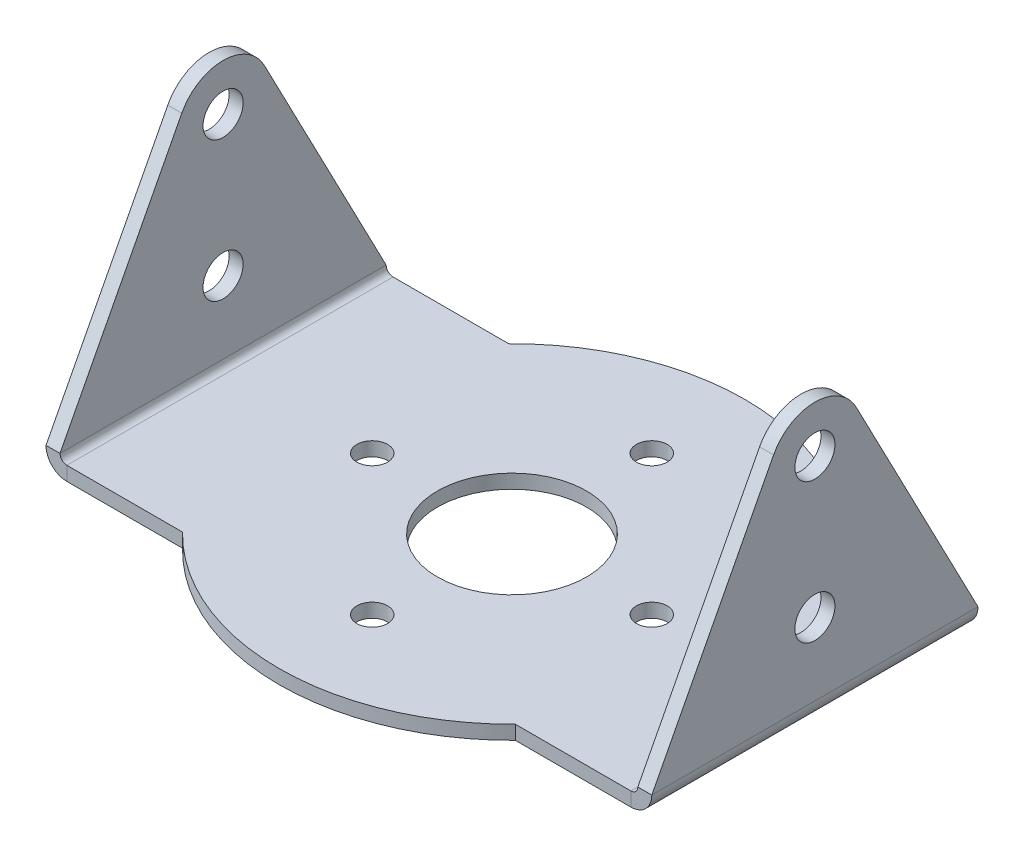
ISO-10303-21;
HEADER;
FILE_DESCRIPTION(('STEP AP214'),'2;1');
FILE_NAME('part.step','',(''),(''),'','','');
FILE_SCHEMA(('AUTOMOTIVE_DESIGN { 1 0 10303 214 1 1 1 1 }'));
ENDSEC;
DATA;
#1=APPLICATION_CONTEXT('core data for automotive mechanical design processes');
#2=APPLICATION_PROTOCOL_DEFINITION('international standard','automotive_design',2000,#1);
#3=PRODUCT_CONTEXT('',#1,'mechanical');
#4=PRODUCT('Part','Part','',(#3));
#5=PRODUCT_RELATED_PRODUCT_CATEGORY('part','',(#4));
#6=PRODUCT_DEFINITION_FORMATION('','',#4);
#7=PRODUCT_DEFINITION_CONTEXT('part definition',#1,'design');
#8=PRODUCT_DEFINITION('design','',#6,#7);
#9=PRODUCT_DEFINITION_SHAPE('','',#8);
#10=(LENGTH_UNIT() NAMED_UNIT(*) SI_UNIT(.MILLI.,.METRE.));
#11=(NAMED_UNIT(*) PLANE_ANGLE_UNIT() SI_UNIT($,.RADIAN.));
#12=(NAMED_UNIT(*) SI_UNIT($,.STERADIAN.) SOLID_ANGLE_UNIT());
#13=UNCERTAINTY_MEASURE_WITH_UNIT(LENGTH_MEASURE(1.E-05),#10,'distance_accuracy_value','');
#14=(GEOMETRIC_REPRESENTATION_CONTEXT(3) GLOBAL_UNCERTAINTY_ASSIGNED_CONTEXT((#13)) GLOBAL_UNIT_ASSIGNED_CONTEXT((#10,
#11,#12)) REPRESENTATION_CONTEXT('',''));
#15=CARTESIAN_POINT('',(0.,0.,0.));
#16=DIRECTION('',(0.,0.,1.));
#17=DIRECTION('',(1.,0.,0.));
#18=AXIS2_PLACEMENT_3D('',#15,#16,#17);
#19=CARTESIAN_POINT('',(-32.5,-1.1601605450924E-13,0.));
#20=DIRECTION('',(1.,0.,0.));
#21=DIRECTION('',(0.,1.,0.));
#22=AXIS2_PLACEMENT_3D('',#19,#20,#21);
#23=PLANE('',#22);
#24=CARTESIAN_POINT('',(-32.5000000000002,10.0000000000002,0.));
#25=DIRECTION('',(1.,0.,0.));
#26=DIRECTION('',(0.,1.,0.));
#27=AXIS2_PLACEMENT_3D('',#24,#25,#26);
#28=CIRCLE('',#27,2.15);
#29=CARTESIAN_POINT('',(-32.5000000000002,12.1500000000002,0.));
#30=VERTEX_POINT('',#29);
#31=EDGE_CURVE('E472',#30,#30,#28,.T.);
#32=ORIENTED_EDGE('',*,*,#31,.T.);
#33=EDGE_LOOP('',(#32));
#34=FACE_BOUND('',#33,.T.);
#35=CARTESIAN_POINT('',(-32.5000000000001,25.0000000000002,0.));
#36=DIRECTION('',(1.,0.,0.));
#37=DIRECTION('',(0.,1.,0.));
#38=AXIS2_PLACEMENT_3D('',#35,#36,#37);
#39=CIRCLE('',#38,2.15);
#40=CARTESIAN_POINT('',(-32.5000000000001,27.1500000000002,0.));
#41=VERTEX_POINT('',#40);
#42=EDGE_CURVE('E465',#41,#41,#39,.T.);
#43=ORIENTED_EDGE('',*,*,#42,.T.);
#44=EDGE_LOOP('',(#43));
#45=FACE_BOUND('',#44,.T.);
#46=DIRECTION('',(0.,0.886819328991356,0.462116303247701));
#47=VECTOR('',#46,1.);
#48=CARTESIAN_POINT('',(-32.5000000000002,7.64936845942169,-14.6794383940091));
#49=LINE('',#48,#47);
#50=CARTESIAN_POINT('',(-32.5000000000002,2.23660000000023,-17.5));
#51=VERTEX_POINT('',#50);
#52=CARTESIAN_POINT('',(-32.5000000000001,27.3105815162387,-4.43409664495678));
#53=VERTEX_POINT('',#52);
#54=EDGE_CURVE('E258',#51,#53,#49,.T.);
#55=ORIENTED_EDGE('',*,*,#54,.F.);
#56=DIRECTION('',(0.,0.,1.));
#57=VECTOR('',#56,1.);
#58=CARTESIAN_POINT('',(-32.5,2.23659999999999,-17.5));
#59=LINE('',#58,#57);
#60=CARTESIAN_POINT('',(-32.5000000000002,2.23660000000023,17.5));
#61=VERTEX_POINT('',#60);
#62=EDGE_CURVE('E339',#61,#51,#59,.F.);
#63=ORIENTED_EDGE('',*,*,#62,.F.);
#64=DIRECTION('',(0.,0.886819328991356,-0.462116303247701));
#65=VECTOR('',#64,1.);
#66=CARTESIAN_POINT('',(-32.5000000000002,7.64936845942169,14.6794383940091));
#67=LINE('',#66,#65);
#68=CARTESIAN_POINT('',(-32.5000000000001,27.3105815162387,4.43409664495678));
#69=VERTEX_POINT('',#68);
#70=EDGE_CURVE('E260',#61,#69,#67,.T.);
#71=ORIENTED_EDGE('',*,*,#70,.T.);
#72=CARTESIAN_POINT('',(-32.5000000000001,25.0000000000002,0.));
#73=DIRECTION('',(1.,0.,0.));
#74=DIRECTION('',(0.,1.,0.));
#75=AXIS2_PLACEMENT_3D('',#72,#73,#74);
#76=CIRCLE('',#75,5.);
#77=EDGE_CURVE('E255',#69,#53,#76,.F.);
#78=ORIENTED_EDGE('',*,*,#77,.T.);
#79=EDGE_LOOP('',(#55,#63,#71,#78));
#80=FACE_BOUND('',#79,.T.);
#81=ADVANCED_FACE('F139',(#34,#45,#80),#23,.F.);
#82=CARTESIAN_POINT('',(-31.,-1.10778832500975E-13,0.));
#83=DIRECTION('',(1.,0.,0.));
#84=DIRECTION('',(0.,1.,0.));
#85=AXIS2_PLACEMENT_3D('',#82,#83,#84);
#86=PLANE('',#85);
#87=CARTESIAN_POINT('',(-31.,10.0000000000002,0.));
#88=DIRECTION('',(1.,0.,0.));
#89=DIRECTION('',(0.,1.,0.));
#90=AXIS2_PLACEMENT_3D('',#87,#88,#89);
#91=CIRCLE('',#90,2.15);
#92=CARTESIAN_POINT('',(-31.,12.1500000000002,0.));
#93=VERTEX_POINT('',#92);
#94=EDGE_CURVE('E292',#93,#93,#91,.T.);
#95=ORIENTED_EDGE('',*,*,#94,.F.);
#96=EDGE_LOOP('',(#95));
#97=FACE_BOUND('',#96,.T.);
#98=CARTESIAN_POINT('',(-31.0000000000001,25.0000000000002,0.));
#99=DIRECTION('',(1.,0.,0.));
#100=DIRECTION('',(0.,1.,0.));
#101=AXIS2_PLACEMENT_3D('',#98,#99,#100);
#102=CIRCLE('',#101,2.15);
#103=CARTESIAN_POINT('',(-31.0000000000001,27.1500000000002,0.));
#104=VERTEX_POINT('',#103);
#105=EDGE_CURVE('E289',#104,#104,#102,.T.);
#106=ORIENTED_EDGE('',*,*,#105,.F.);
#107=EDGE_LOOP('',(#106));
#108=FACE_BOUND('',#107,.T.);
#109=DIRECTION('',(0.,0.,1.));
#110=VECTOR('',#109,1.);
#111=CARTESIAN_POINT('',(-31.,2.2366,-17.5));
#112=LINE('',#111,#110);
#113=CARTESIAN_POINT('',(-31.,2.23660000000022,-17.5));
#114=VERTEX_POINT('',#113);
#115=CARTESIAN_POINT('',(-31.,2.23660000000022,17.5));
#116=VERTEX_POINT('',#115);
#117=EDGE_CURVE('E345',#114,#116,#112,.T.);
#118=ORIENTED_EDGE('',*,*,#117,.F.);
#119=DIRECTION('',(0.,0.886819328991356,0.462116303247701));
#120=VECTOR('',#119,1.);
#121=CARTESIAN_POINT('',(-31.,7.64936845942151,-14.6794383940092));
#122=LINE('',#121,#120);
#123=CARTESIAN_POINT('',(-31.0000000000001,27.3105815162387,-4.43409664495678));
#124=VERTEX_POINT('',#123);
#125=EDGE_CURVE('E282',#114,#124,#122,.T.);
#126=ORIENTED_EDGE('',*,*,#125,.T.);
#127=CARTESIAN_POINT('',(-31.0000000000001,25.0000000000002,0.));
#128=DIRECTION('',(1.,0.,0.));
#129=DIRECTION('',(0.,1.,0.));
#130=AXIS2_PLACEMENT_3D('',#127,#128,#129);
#131=CIRCLE('',#130,5.);
#132=CARTESIAN_POINT('',(-31.0000000000001,27.3105815162387,4.43409664495678));
#133=VERTEX_POINT('',#132);
#134=EDGE_CURVE('E278',#133,#124,#131,.F.);
#135=ORIENTED_EDGE('',*,*,#134,.F.);
#136=DIRECTION('',(0.,0.886819328991356,-0.462116303247701));
#137=VECTOR('',#136,1.);
#138=CARTESIAN_POINT('',(-31.,7.64936845942151,14.6794383940092));
#139=LINE('',#138,#137);
#140=EDGE_CURVE('E306',#116,#133,#139,.T.);
#141=ORIENTED_EDGE('',*,*,#140,.F.);
#142=EDGE_LOOP('',(#118,#126,#135,#141));
#143=FACE_BOUND('',#142,.T.);
#144=ADVANCED_FACE('F496',(#97,#108,#143),#86,.T.);
#145=CARTESIAN_POINT('',(32.5,-1.1601605450924E-13,0.));
#146=DIRECTION('',(-1.,0.,0.));
#147=DIRECTION('',(0.,-1.,0.));
#148=AXIS2_PLACEMENT_3D('',#145,#146,#147);
#149=PLANE('',#148);
#150=CARTESIAN_POINT('',(32.5,10.,0.));
#151=DIRECTION('',(1.,0.,0.));
#152=DIRECTION('',(0.,1.,0.));
#153=AXIS2_PLACEMENT_3D('',#150,#151,#152);
#154=CIRCLE('',#153,2.15);
#155=CARTESIAN_POINT('',(32.5,12.15,0.));
#156=VERTEX_POINT('',#155);
#157=EDGE_CURVE('E475',#156,#156,#154,.T.);
#158=ORIENTED_EDGE('',*,*,#157,.F.);
#159=EDGE_LOOP('',(#158));
#160=FACE_BOUND('',#159,.T.);
#161=CARTESIAN_POINT('',(32.5000000000001,25.,0.));
#162=DIRECTION('',(1.,0.,0.));
#163=DIRECTION('',(0.,1.,0.));
#164=AXIS2_PLACEMENT_3D('',#161,#162,#163);
#165=CIRCLE('',#164,2.15);
#166=CARTESIAN_POINT('',(32.5000000000001,27.15,0.));
#167=VERTEX_POINT('',#166);
#168=EDGE_CURVE('E467',#167,#167,#165,.T.);
#169=ORIENTED_EDGE('',*,*,#168,.F.);
#170=EDGE_LOOP('',(#169));
#171=FACE_BOUND('',#170,.T.);
#172=DIRECTION('',(0.,0.886819328991356,0.462116303247701));
#173=VECTOR('',#172,1.);
#174=CARTESIAN_POINT('',(32.5,7.64936845942145,-14.6794383940091));
#175=LINE('',#174,#173);
#176=CARTESIAN_POINT('',(32.5,2.23659999999999,-17.5));
#177=VERTEX_POINT('',#176);
#178=CARTESIAN_POINT('',(32.5000000000001,27.3105815162385,-4.43409664495678));
#179=VERTEX_POINT('',#178);
#180=EDGE_CURVE('E274',#177,#179,#175,.T.);
#181=ORIENTED_EDGE('',*,*,#180,.T.);
#182=CARTESIAN_POINT('',(32.5000000000001,25.,0.));
#183=DIRECTION('',(1.,0.,0.));
#184=DIRECTION('',(0.,1.,0.));
#185=AXIS2_PLACEMENT_3D('',#182,#183,#184);
#186=CIRCLE('',#185,5.);
#187=CARTESIAN_POINT('',(32.5000000000001,27.3105815162385,4.43409664495678));
#188=VERTEX_POINT('',#187);
#189=EDGE_CURVE('E296',#188,#179,#186,.F.);
#190=ORIENTED_EDGE('',*,*,#189,.F.);
#191=DIRECTION('',(0.,0.886819328991356,-0.462116303247701));
#192=VECTOR('',#191,1.);
#193=CARTESIAN_POINT('',(32.5,7.64936845942145,14.6794383940091));
#194=LINE('',#193,#192);
#195=CARTESIAN_POINT('',(32.5,2.23659999999999,17.5));
#196=VERTEX_POINT('',#195);
#197=EDGE_CURVE('E295',#196,#188,#194,.T.);
#198=ORIENTED_EDGE('',*,*,#197,.F.);
#199=DIRECTION('',(0.,0.,-1.));
#200=VECTOR('',#199,1.);
#201=CARTESIAN_POINT('',(32.5,2.23659999999999,17.5));
#202=LINE('',#201,#200);
#203=EDGE_CURVE('E309',#177,#196,#202,.F.);
#204=ORIENTED_EDGE('',*,*,#203,.F.);
#205=EDGE_LOOP('',(#181,#190,#198,#204));
#206=FACE_BOUND('',#205,.T.);
#207=ADVANCED_FACE('F447',(#160,#171,#206),#149,.F.);
#208=CARTESIAN_POINT('',(31.,-1.10778832500975E-13,0.));
#209=DIRECTION('',(-1.,0.,0.));
#210=DIRECTION('',(0.,-1.,0.));
#211=AXIS2_PLACEMENT_3D('',#208,#209,#210);
#212=PLANE('',#211);
#213=CARTESIAN_POINT('',(31.,10.,0.));
#214=DIRECTION('',(-1.,0.,0.));
#215=DIRECTION('',(0.,-1.,0.));
#216=AXIS2_PLACEMENT_3D('',#213,#214,#215);
#217=CIRCLE('',#216,2.15);
#218=CARTESIAN_POINT('',(31.,7.85,0.));
#219=VERTEX_POINT('',#218);
#220=EDGE_CURVE('E143',#219,#219,#217,.T.);
#221=ORIENTED_EDGE('',*,*,#220,.F.);
#222=EDGE_LOOP('',(#221));
#223=FACE_BOUND('',#222,.T.);
#224=CARTESIAN_POINT('',(31.0000000000001,25.,0.));
#225=DIRECTION('',(-1.,0.,0.));
#226=DIRECTION('',(0.,-1.,0.));
#227=AXIS2_PLACEMENT_3D('',#224,#225,#226);
#228=CIRCLE('',#227,2.15);
#229=CARTESIAN_POINT('',(31.0000000000001,22.85,0.));
#230=VERTEX_POINT('',#229);
#231=EDGE_CURVE('E288',#230,#230,#228,.T.);
#232=ORIENTED_EDGE('',*,*,#231,.F.);
#233=EDGE_LOOP('',(#232));
#234=FACE_BOUND('',#233,.T.);
#235=CARTESIAN_POINT('',(31.0000000000001,25.,0.));
#236=DIRECTION('',(-1.,0.,0.));
#237=DIRECTION('',(0.,-1.,0.));
#238=AXIS2_PLACEMENT_3D('',#235,#236,#237);
#239=CIRCLE('',#238,5.);
#240=CARTESIAN_POINT('',(31.0000000000001,27.3105815162385,-4.43409664495678));
#241=VERTEX_POINT('',#240);
#242=CARTESIAN_POINT('',(31.0000000000001,27.3105815162385,4.43409664495678));
#243=VERTEX_POINT('',#242);
#244=EDGE_CURVE('E303',#241,#243,#239,.F.);
#245=ORIENTED_EDGE('',*,*,#244,.F.);
#246=DIRECTION('',(0.,-0.886819328991356,-0.462116303247701));
#247=VECTOR('',#246,1.);
#248=CARTESIAN_POINT('',(31.,7.64936845942146,-14.6794383940091));
#249=LINE('',#248,#247);
#250=CARTESIAN_POINT('',(31.,2.2366,-17.5));
#251=VERTEX_POINT('',#250);
#252=EDGE_CURVE('E279',#241,#251,#249,.T.);
#253=ORIENTED_EDGE('',*,*,#252,.T.);
#254=DIRECTION('',(0.,0.,-1.));
#255=VECTOR('',#254,1.);
#256=CARTESIAN_POINT('',(31.,2.2366,17.5));
#257=LINE('',#256,#255);
#258=CARTESIAN_POINT('',(31.0000000000001,2.2366,17.5));
#259=VERTEX_POINT('',#258);
#260=EDGE_CURVE('E316',#259,#251,#257,.T.);
#261=ORIENTED_EDGE('',*,*,#260,.F.);
#262=DIRECTION('',(0.,-0.886819328991356,0.462116303247701));
#263=VECTOR('',#262,1.);
#264=CARTESIAN_POINT('',(31.,7.64936845942146,14.6794383940091));
#265=LINE('',#264,#263);
#266=EDGE_CURVE('E13',#243,#259,#265,.T.);
#267=ORIENTED_EDGE('',*,*,#266,.F.);
#268=EDGE_LOOP('',(#245,#253,#261,#267));
#269=FACE_BOUND('',#268,.T.);
#270=ADVANCED_FACE('F443',(#223,#234,#269),#212,.T.);
#271=CARTESIAN_POINT('',(0.,1.5,0.));
#272=DIRECTION('',(0.,1.,0.));
#273=DIRECTION('',(0.,0.,1.));
#274=AXIS2_PLACEMENT_3D('',#271,#272,#273);
#275=PLANE('',#274);
#276=CARTESIAN_POINT('',(0.,1.5,15.));
#277=DIRECTION('',(0.,1.,0.));
#278=DIRECTION('',(0.,0.,1.));
#279=AXIS2_PLACEMENT_3D('',#276,#277,#278);
#280=CIRCLE('',#279,1.65);
#281=CARTESIAN_POINT('',(0.,1.5,16.65));
#282=VERTEX_POINT('',#281);
#283=EDGE_CURVE('E378',#282,#282,#280,.T.);
#284=ORIENTED_EDGE('',*,*,#283,.F.);
#285=EDGE_LOOP('',(#284));
#286=FACE_BOUND('',#285,.T.);
#287=CARTESIAN_POINT('',(0.,1.5,-15.));
#288=DIRECTION('',(0.,1.,0.));
#289=DIRECTION('',(0.,0.,1.));
#290=AXIS2_PLACEMENT_3D('',#287,#288,#289);
#291=CIRCLE('',#290,1.65);
#292=CARTESIAN_POINT('',(0.,1.5,-13.35));
#293=VERTEX_POINT('',#292);
#294=EDGE_CURVE('E390',#293,#293,#291,.T.);
#295=ORIENTED_EDGE('',*,*,#294,.F.);
#296=EDGE_LOOP('',(#295));
#297=FACE_BOUND('',#296,.T.);
#298=CARTESIAN_POINT('',(0.,1.5,0.));
#299=DIRECTION('',(0.,1.,0.));
#300=DIRECTION('',(0.,0.,1.));
#301=AXIS2_PLACEMENT_3D('',#298,#299,#300);
#302=CIRCLE('',#301,8.);
#303=CARTESIAN_POINT('',(0.,1.5,8.));
#304=VERTEX_POINT('',#303);
#305=EDGE_CURVE('E396',#304,#304,#302,.T.);
#306=ORIENTED_EDGE('',*,*,#305,.F.);
#307=EDGE_LOOP('',(#306));
#308=FACE_BOUND('',#307,.T.);
#309=CARTESIAN_POINT('',(-15.,1.5,0.));
#310=DIRECTION('',(0.,1.,0.));
#311=DIRECTION('',(0.,0.,1.));
#312=AXIS2_PLACEMENT_3D('',#309,#310,#311);
#313=CIRCLE('',#312,1.65);
#314=CARTESIAN_POINT('',(-15.,1.5,1.65000000000003));
#315=VERTEX_POINT('',#314);
#316=EDGE_CURVE('E384',#315,#315,#313,.T.);
#317=ORIENTED_EDGE('',*,*,#316,.F.);
#318=EDGE_LOOP('',(#317));
#319=FACE_BOUND('',#318,.T.);
#320=CARTESIAN_POINT('',(15.,1.5,0.));
#321=DIRECTION('',(0.,1.,0.));
#322=DIRECTION('',(0.,0.,1.));
#323=AXIS2_PLACEMENT_3D('',#320,#321,#322);
#324=CIRCLE('',#323,1.65);
#325=CARTESIAN_POINT('',(15.,1.5,1.64999999999997));
#326=VERTEX_POINT('',#325);
#327=EDGE_CURVE('E372',#326,#326,#324,.T.);
#328=ORIENTED_EDGE('',*,*,#327,.F.);
#329=EDGE_LOOP('',(#328));
#330=FACE_BOUND('',#329,.T.);
#331=DIRECTION('',(1.,0.,0.));
#332=VECTOR('',#331,1.);
#333=CARTESIAN_POINT('',(17.8535710713571,1.5,17.5));
#334=LINE('',#333,#332);
#335=CARTESIAN_POINT('',(17.8535710713571,1.5,17.5));
#336=VERTEX_POINT('',#335);
#337=CARTESIAN_POINT('',(30.2634,1.5,17.5));
#338=VERTEX_POINT('',#337);
#339=EDGE_CURVE('E414',#336,#338,#334,.T.);
#340=ORIENTED_EDGE('',*,*,#339,.T.);
#341=DIRECTION('',(0.,0.,-1.));
#342=VECTOR('',#341,1.);
#343=CARTESIAN_POINT('',(30.2634,1.5,-17.5));
#344=LINE('',#343,#342);
#345=CARTESIAN_POINT('',(30.2634,1.5,-17.5));
#346=VERTEX_POINT('',#345);
#347=EDGE_CURVE('E156',#346,#338,#344,.F.);
#348=ORIENTED_EDGE('',*,*,#347,.F.);
#349=DIRECTION('',(-1.,0.,0.));
#350=VECTOR('',#349,1.);
#351=CARTESIAN_POINT('',(17.8535710713571,1.5,-17.5));
#352=LINE('',#351,#350);
#353=CARTESIAN_POINT('',(17.8535710713571,1.5,-17.5));
#354=VERTEX_POINT('',#353);
#355=EDGE_CURVE('E402',#346,#354,#352,.T.);
#356=ORIENTED_EDGE('',*,*,#355,.T.);
#357=CARTESIAN_POINT('',(0.,1.5,0.));
#358=DIRECTION('',(0.,1.,0.));
#359=DIRECTION('',(0.,0.,1.));
#360=AXIS2_PLACEMENT_3D('',#357,#358,#359);
#361=CIRCLE('',#360,25.);
#362=CARTESIAN_POINT('',(-17.8535710713571,1.5,-17.5));
#363=VERTEX_POINT('',#362);
#364=EDGE_CURVE('E404',#354,#363,#361,.T.);
#365=ORIENTED_EDGE('',*,*,#364,.T.);
#366=DIRECTION('',(-1.,0.,0.));
#367=VECTOR('',#366,1.);
#368=CARTESIAN_POINT('',(-32.5,1.5,-17.5));
#369=LINE('',#368,#367);
#370=CARTESIAN_POINT('',(-30.2634,1.5,-17.5));
#371=VERTEX_POINT('',#370);
#372=EDGE_CURVE('E407',#363,#371,#369,.T.);
#373=ORIENTED_EDGE('',*,*,#372,.T.);
#374=DIRECTION('',(0.,0.,1.));
#375=VECTOR('',#374,1.);
#376=CARTESIAN_POINT('',(-30.2634,1.5,17.5));
#377=LINE('',#376,#375);
#378=CARTESIAN_POINT('',(-30.2634,1.5,17.5));
#379=VERTEX_POINT('',#378);
#380=EDGE_CURVE('E361',#379,#371,#377,.F.);
#381=ORIENTED_EDGE('',*,*,#380,.F.);
#382=DIRECTION('',(1.,0.,0.));
#383=VECTOR('',#382,1.);
#384=CARTESIAN_POINT('',(-32.5,1.5,17.5));
#385=LINE('',#384,#383);
#386=CARTESIAN_POINT('',(-17.8535710713571,1.5,17.5));
#387=VERTEX_POINT('',#386);
#388=EDGE_CURVE('E410',#379,#387,#385,.T.);
#389=ORIENTED_EDGE('',*,*,#388,.T.);
#390=CARTESIAN_POINT('',(0.,1.5,0.));
#391=DIRECTION('',(0.,1.,0.));
#392=DIRECTION('',(0.,0.,1.));
#393=AXIS2_PLACEMENT_3D('',#390,#391,#392);
#394=CIRCLE('',#393,25.);
#395=EDGE_CURVE('E412',#387,#336,#394,.T.);
#396=ORIENTED_EDGE('',*,*,#395,.T.);
#397=EDGE_LOOP('',(#340,#348,#356,#365,#373,#381,#389,#396));
#398=FACE_BOUND('',#397,.T.);
#399=ADVANCED_FACE('F446',(#286,#297,#308,#319,#330,#398),#275,.T.);
#400=CARTESIAN_POINT('',(0.,0.,0.));
#401=DIRECTION('',(0.,1.,0.));
#402=DIRECTION('',(0.,0.,1.));
#403=AXIS2_PLACEMENT_3D('',#400,#401,#402);
#404=PLANE('',#403);
#405=CARTESIAN_POINT('',(0.,0.,0.));
#406=DIRECTION('',(0.,1.,0.));
#407=DIRECTION('',(0.,0.,1.));
#408=AXIS2_PLACEMENT_3D('',#405,#406,#407);
#409=CIRCLE('',#408,8.);
#410=CARTESIAN_POINT('',(0.,0.,8.));
#411=VERTEX_POINT('',#410);
#412=EDGE_CURVE('E393',#411,#411,#409,.T.);
#413=ORIENTED_EDGE('',*,*,#412,.T.);
#414=EDGE_LOOP('',(#413));
#415=FACE_BOUND('',#414,.T.);
#416=CARTESIAN_POINT('',(0.,0.,-15.));
#417=DIRECTION('',(0.,1.,0.));
#418=DIRECTION('',(0.,0.,1.));
#419=AXIS2_PLACEMENT_3D('',#416,#417,#418);
#420=CIRCLE('',#419,1.65);
#421=CARTESIAN_POINT('',(0.,0.,-13.35));
#422=VERTEX_POINT('',#421);
#423=EDGE_CURVE('E387',#422,#422,#420,.T.);
#424=ORIENTED_EDGE('',*,*,#423,.T.);
#425=EDGE_LOOP('',(#424));
#426=FACE_BOUND('',#425,.T.);
#427=CARTESIAN_POINT('',(-15.,0.,0.));
#428=DIRECTION('',(0.,1.,0.));
#429=DIRECTION('',(0.,0.,1.));
#430=AXIS2_PLACEMENT_3D('',#427,#428,#429);
#431=CIRCLE('',#430,1.65);
#432=CARTESIAN_POINT('',(-15.,0.,1.65000000000003));
#433=VERTEX_POINT('',#432);
#434=EDGE_CURVE('E381',#433,#433,#431,.T.);
#435=ORIENTED_EDGE('',*,*,#434,.T.);
#436=EDGE_LOOP('',(#435));
#437=FACE_BOUND('',#436,.T.);
#438=CARTESIAN_POINT('',(0.,0.,15.));
#439=DIRECTION('',(0.,1.,0.));
#440=DIRECTION('',(0.,0.,1.));
#441=AXIS2_PLACEMENT_3D('',#438,#439,#440);
#442=CIRCLE('',#441,1.65);
#443=CARTESIAN_POINT('',(0.,0.,16.65));
#444=VERTEX_POINT('',#443);
#445=EDGE_CURVE('E375',#444,#444,#442,.T.);
#446=ORIENTED_EDGE('',*,*,#445,.T.);
#447=EDGE_LOOP('',(#446));
#448=FACE_BOUND('',#447,.T.);
#449=CARTESIAN_POINT('',(15.,0.,0.));
#450=DIRECTION('',(0.,1.,0.));
#451=DIRECTION('',(0.,0.,1.));
#452=AXIS2_PLACEMENT_3D('',#449,#450,#451);
#453=CIRCLE('',#452,1.65);
#454=CARTESIAN_POINT('',(15.,0.,1.64999999999997));
#455=VERTEX_POINT('',#454);
#456=EDGE_CURVE('E369',#455,#455,#453,.T.);
#457=ORIENTED_EDGE('',*,*,#456,.T.);
#458=EDGE_LOOP('',(#457));
#459=FACE_BOUND('',#458,.T.);
#460=DIRECTION('',(0.,0.,-1.));
#461=VECTOR('',#460,1.);
#462=CARTESIAN_POINT('',(30.2634,0.,-17.5));
#463=LINE('',#462,#461);
#464=CARTESIAN_POINT('',(30.2634,0.,-17.5));
#465=VERTEX_POINT('',#464);
#466=CARTESIAN_POINT('',(30.2634,0.,17.5));
#467=VERTEX_POINT('',#466);
#468=EDGE_CURVE('E320',#465,#467,#463,.F.);
#469=ORIENTED_EDGE('',*,*,#468,.T.);
#470=DIRECTION('',(1.,0.,0.));
#471=VECTOR('',#470,1.);
#472=CARTESIAN_POINT('',(17.8535710713571,0.,17.5));
#473=LINE('',#472,#471);
#474=CARTESIAN_POINT('',(17.8535710713571,0.,17.5));
#475=VERTEX_POINT('',#474);
#476=EDGE_CURVE('E405',#475,#467,#473,.T.);
#477=ORIENTED_EDGE('',*,*,#476,.F.);
#478=CARTESIAN_POINT('',(0.,0.,0.));
#479=DIRECTION('',(0.,1.,0.));
#480=DIRECTION('',(0.,0.,1.));
#481=AXIS2_PLACEMENT_3D('',#478,#479,#480);
#482=CIRCLE('',#481,25.);
#483=CARTESIAN_POINT('',(-17.8535710713571,0.,17.5));
#484=VERTEX_POINT('',#483);
#485=EDGE_CURVE('E425',#484,#475,#482,.T.);
#486=ORIENTED_EDGE('',*,*,#485,.F.);
#487=DIRECTION('',(1.,0.,0.));
#488=VECTOR('',#487,1.);
#489=CARTESIAN_POINT('',(-32.5,0.,17.5));
#490=LINE('',#489,#488);
#491=CARTESIAN_POINT('',(-30.2634,0.,17.5));
#492=VERTEX_POINT('',#491);
#493=EDGE_CURVE('E423',#492,#484,#490,.T.);
#494=ORIENTED_EDGE('',*,*,#493,.F.);
#495=DIRECTION('',(0.,0.,1.));
#496=VECTOR('',#495,1.);
#497=CARTESIAN_POINT('',(-30.2634,0.,17.5));
#498=LINE('',#497,#496);
#499=CARTESIAN_POINT('',(-30.2634,0.,-17.5));
#500=VERTEX_POINT('',#499);
#501=EDGE_CURVE('E349',#492,#500,#498,.F.);
#502=ORIENTED_EDGE('',*,*,#501,.T.);
#503=DIRECTION('',(-1.,0.,0.));
#504=VECTOR('',#503,1.);
#505=CARTESIAN_POINT('',(-32.5,0.,-17.5));
#506=LINE('',#505,#504);
#507=CARTESIAN_POINT('',(-17.8535710713571,0.,-17.5));
#508=VERTEX_POINT('',#507);
#509=EDGE_CURVE('E420',#508,#500,#506,.T.);
#510=ORIENTED_EDGE('',*,*,#509,.F.);
#511=CARTESIAN_POINT('',(0.,0.,0.));
#512=DIRECTION('',(0.,1.,0.));
#513=DIRECTION('',(0.,0.,1.));
#514=AXIS2_PLACEMENT_3D('',#511,#512,#513);
#515=CIRCLE('',#514,25.);
#516=CARTESIAN_POINT('',(17.8535710713571,0.,-17.5));
#517=VERTEX_POINT('',#516);
#518=EDGE_CURVE('E418',#517,#508,#515,.T.);
#519=ORIENTED_EDGE('',*,*,#518,.F.);
#520=DIRECTION('',(-1.,0.,0.));
#521=VECTOR('',#520,1.);
#522=CARTESIAN_POINT('',(17.8535710713571,0.,-17.5));
#523=LINE('',#522,#521);
#524=EDGE_CURVE('E399',#465,#517,#523,.T.);
#525=ORIENTED_EDGE('',*,*,#524,.F.);
#526=EDGE_LOOP('',(#469,#477,#486,#494,#502,#510,#519,#525));
#527=FACE_BOUND('',#526,.T.);
#528=ADVANCED_FACE('F547',(#415,#426,#437,#448,#459,#527),#404,.F.);
#529=CARTESIAN_POINT('',(17.8535710713571,1.5,-17.5));
#530=DIRECTION('',(0.,0.,1.));
#531=DIRECTION('',(1.,0.,0.));
#532=AXIS2_PLACEMENT_3D('',#529,#530,#531);
#533=PLANE('',#532);
#534=DIRECTION('',(0.,-1.,0.));
#535=VECTOR('',#534,1.);
#536=CARTESIAN_POINT('',(30.2634,1.5,-17.5));
#537=LINE('',#536,#535);
#538=EDGE_CURVE('E327',#346,#465,#537,.T.);
#539=ORIENTED_EDGE('',*,*,#538,.T.);
#540=ORIENTED_EDGE('',*,*,#524,.T.);
#541=DIRECTION('',(0.,-1.,0.));
#542=VECTOR('',#541,1.);
#543=CARTESIAN_POINT('',(17.8535710713571,1.5,-17.5));
#544=LINE('',#543,#542);
#545=EDGE_CURVE('E148',#354,#517,#544,.T.);
#546=ORIENTED_EDGE('',*,*,#545,.F.);
#547=ORIENTED_EDGE('',*,*,#355,.F.);
#548=EDGE_LOOP('',(#539,#540,#546,#547));
#549=FACE_BOUND('',#548,.T.);
#550=ADVANCED_FACE('F141',(#549),#533,.F.);
#551=CARTESIAN_POINT('',(17.8535710713571,1.5,17.5));
#552=DIRECTION('',(0.,0.,-1.));
#553=DIRECTION('',(-1.,0.,0.));
#554=AXIS2_PLACEMENT_3D('',#551,#552,#553);
#555=PLANE('',#554);
#556=DIRECTION('',(0.,-1.,0.));
#557=VECTOR('',#556,1.);
#558=CARTESIAN_POINT('',(30.2634,1.5,17.5));
#559=LINE('',#558,#557);
#560=EDGE_CURVE('E164',#338,#467,#559,.T.);
#561=ORIENTED_EDGE('',*,*,#560,.F.);
#562=ORIENTED_EDGE('',*,*,#339,.F.);
#563=DIRECTION('',(0.,-1.,0.));
#564=VECTOR('',#563,1.);
#565=CARTESIAN_POINT('',(17.8535710713571,1.5,17.5));
#566=LINE('',#565,#564);
#567=EDGE_CURVE('E416',#336,#475,#566,.T.);
#568=ORIENTED_EDGE('',*,*,#567,.T.);
#569=ORIENTED_EDGE('',*,*,#476,.T.);
#570=EDGE_LOOP('',(#561,#562,#568,#569));
#571=FACE_BOUND('',#570,.T.);
#572=ADVANCED_FACE('F552',(#571),#555,.F.);
#573=CARTESIAN_POINT('',(-32.5,1.5,-17.5));
#574=DIRECTION('',(0.,0.,1.));
#575=DIRECTION('',(1.,0.,0.));
#576=AXIS2_PLACEMENT_3D('',#573,#574,#575);
#577=PLANE('',#576);
#578=DIRECTION('',(0.,-1.,0.));
#579=VECTOR('',#578,1.);
#580=CARTESIAN_POINT('',(-30.2634,1.5,-17.5));
#581=LINE('',#580,#579);
#582=EDGE_CURVE('E366',#371,#500,#581,.T.);
#583=ORIENTED_EDGE('',*,*,#582,.F.);
#584=ORIENTED_EDGE('',*,*,#372,.F.);
#585=DIRECTION('',(0.,-1.,0.));
#586=VECTOR('',#585,1.);
#587=CARTESIAN_POINT('',(-17.8535710713571,1.5,-17.5));
#588=LINE('',#587,#586);
#589=EDGE_CURVE('E433',#363,#508,#588,.T.);
#590=ORIENTED_EDGE('',*,*,#589,.T.);
#591=ORIENTED_EDGE('',*,*,#509,.T.);
#592=EDGE_LOOP('',(#583,#584,#590,#591));
#593=FACE_BOUND('',#592,.T.);
#594=ADVANCED_FACE('F555',(#593),#577,.F.);
#595=CARTESIAN_POINT('',(-32.5,1.5,17.5));
#596=DIRECTION('',(0.,0.,-1.));
#597=DIRECTION('',(-1.,0.,0.));
#598=AXIS2_PLACEMENT_3D('',#595,#596,#597);
#599=PLANE('',#598);
#600=DIRECTION('',(0.,-1.,0.));
#601=VECTOR('',#600,1.);
#602=CARTESIAN_POINT('',(-30.2634,1.5,17.5));
#603=LINE('',#602,#601);
#604=EDGE_CURVE('E355',#379,#492,#603,.T.);
#605=ORIENTED_EDGE('',*,*,#604,.T.);
#606=ORIENTED_EDGE('',*,*,#493,.T.);
#607=DIRECTION('',(0.,-1.,0.));
#608=VECTOR('',#607,1.);
#609=CARTESIAN_POINT('',(-17.8535710713571,1.5,17.5));
#610=LINE('',#609,#608);
#611=EDGE_CURVE('E430',#387,#484,#610,.T.);
#612=ORIENTED_EDGE('',*,*,#611,.F.);
#613=ORIENTED_EDGE('',*,*,#388,.F.);
#614=EDGE_LOOP('',(#605,#606,#612,#613));
#615=FACE_BOUND('',#614,.T.);
#616=ADVANCED_FACE('F560',(#615),#599,.F.);
#617=CARTESIAN_POINT('',(0.,1.5,0.));
#618=DIRECTION('',(0.,-1.,0.));
#619=DIRECTION('',(0.,0.,-1.));
#620=AXIS2_PLACEMENT_3D('',#617,#618,#619);
#621=CYLINDRICAL_SURFACE('',#620,25.);
#622=ORIENTED_EDGE('',*,*,#518,.T.);
#623=ORIENTED_EDGE('',*,*,#589,.F.);
#624=ORIENTED_EDGE('',*,*,#364,.F.);
#625=ORIENTED_EDGE('',*,*,#545,.T.);
#626=EDGE_LOOP('',(#622,#623,#624,#625));
#627=FACE_BOUND('',#626,.T.);
#628=ADVANCED_FACE('F558',(#627),#621,.T.);
#629=CARTESIAN_POINT('',(0.,1.5,0.));
#630=DIRECTION('',(0.,-1.,0.));
#631=DIRECTION('',(0.,0.,-1.));
#632=AXIS2_PLACEMENT_3D('',#629,#630,#631);
#633=CYLINDRICAL_SURFACE('',#632,25.);
#634=ORIENTED_EDGE('',*,*,#485,.T.);
#635=ORIENTED_EDGE('',*,*,#567,.F.);
#636=ORIENTED_EDGE('',*,*,#395,.F.);
#637=ORIENTED_EDGE('',*,*,#611,.T.);
#638=EDGE_LOOP('',(#634,#635,#636,#637));
#639=FACE_BOUND('',#638,.T.);
#640=ADVANCED_FACE('F543',(#639),#633,.T.);
#641=CARTESIAN_POINT('',(0.,1.5,0.));
#642=DIRECTION('',(0.,-1.,0.));
#643=DIRECTION('',(0.,0.,-1.));
#644=AXIS2_PLACEMENT_3D('',#641,#642,#643);
#645=CYLINDRICAL_SURFACE('',#644,8.);
#646=ORIENTED_EDGE('',*,*,#305,.T.);
#647=EDGE_LOOP('',(#646));
#648=FACE_BOUND('',#647,.T.);
#649=ORIENTED_EDGE('',*,*,#412,.F.);
#650=EDGE_LOOP('',(#649));
#651=FACE_BOUND('',#650,.T.);
#652=ADVANCED_FACE('F539',(#648,#651),#645,.F.);
#653=CARTESIAN_POINT('',(0.,1.5,-15.));
#654=DIRECTION('',(0.,-1.,0.));
#655=DIRECTION('',(0.,0.,-1.));
#656=AXIS2_PLACEMENT_3D('',#653,#654,#655);
#657=CYLINDRICAL_SURFACE('',#656,1.65);
#658=ORIENTED_EDGE('',*,*,#294,.T.);
#659=EDGE_LOOP('',(#658));
#660=FACE_BOUND('',#659,.T.);
#661=ORIENTED_EDGE('',*,*,#423,.F.);
#662=EDGE_LOOP('',(#661));
#663=FACE_BOUND('',#662,.T.);
#664=ADVANCED_FACE('F535',(#660,#663),#657,.F.);
#665=CARTESIAN_POINT('',(-15.,1.5,0.));
#666=DIRECTION('',(0.,-1.,0.));
#667=DIRECTION('',(0.,0.,-1.));
#668=AXIS2_PLACEMENT_3D('',#665,#666,#667);
#669=CYLINDRICAL_SURFACE('',#668,1.65);
#670=ORIENTED_EDGE('',*,*,#316,.T.);
#671=EDGE_LOOP('',(#670));
#672=FACE_BOUND('',#671,.T.);
#673=ORIENTED_EDGE('',*,*,#434,.F.);
#674=EDGE_LOOP('',(#673));
#675=FACE_BOUND('',#674,.T.);
#676=ADVANCED_FACE('F531',(#672,#675),#669,.F.);
#677=CARTESIAN_POINT('',(0.,1.5,15.));
#678=DIRECTION('',(0.,-1.,0.));
#679=DIRECTION('',(0.,0.,-1.));
#680=AXIS2_PLACEMENT_3D('',#677,#678,#679);
#681=CYLINDRICAL_SURFACE('',#680,1.65);
#682=ORIENTED_EDGE('',*,*,#283,.T.);
#683=EDGE_LOOP('',(#682));
#684=FACE_BOUND('',#683,.T.);
#685=ORIENTED_EDGE('',*,*,#445,.F.);
#686=EDGE_LOOP('',(#685));
#687=FACE_BOUND('',#686,.T.);
#688=ADVANCED_FACE('F527',(#684,#687),#681,.F.);
#689=CARTESIAN_POINT('',(15.,1.5,0.));
#690=DIRECTION('',(0.,-1.,0.));
#691=DIRECTION('',(0.,0.,-1.));
#692=AXIS2_PLACEMENT_3D('',#689,#690,#691);
#693=CYLINDRICAL_SURFACE('',#692,1.65);
#694=ORIENTED_EDGE('',*,*,#327,.T.);
#695=EDGE_LOOP('',(#694));
#696=FACE_BOUND('',#695,.T.);
#697=ORIENTED_EDGE('',*,*,#456,.F.);
#698=EDGE_LOOP('',(#697));
#699=FACE_BOUND('',#698,.T.);
#700=ADVANCED_FACE('F520',(#696,#699),#693,.F.);
#701=CARTESIAN_POINT('',(-30.2634,2.2366,-17.5));
#702=DIRECTION('',(0.,0.,-1.));
#703=DIRECTION('',(-1.,0.,0.));
#704=AXIS2_PLACEMENT_3D('',#701,#702,#703);
#705=PLANE('',#704);
#706=DIRECTION('',(1.,0.,0.));
#707=VECTOR('',#706,1.);
#708=CARTESIAN_POINT('',(-32.5,2.23659999999999,-17.5));
#709=LINE('',#708,#707);
#710=EDGE_CURVE('E272',#114,#51,#709,.F.);
#711=ORIENTED_EDGE('',*,*,#710,.F.);
#712=CARTESIAN_POINT('',(-30.2634,2.2366,-17.5));
#713=DIRECTION('',(0.,0.,1.));
#714=DIRECTION('',(1.,0.,0.));
#715=AXIS2_PLACEMENT_3D('',#712,#713,#714);
#716=CIRCLE('',#715,0.7366);
#717=EDGE_CURVE('E358',#371,#114,#716,.F.);
#718=ORIENTED_EDGE('',*,*,#717,.F.);
#719=ORIENTED_EDGE('',*,*,#582,.T.);
#720=CARTESIAN_POINT('',(-30.2634,2.2366,-17.5));
#721=DIRECTION('',(0.,0.,1.));
#722=DIRECTION('',(1.,0.,0.));
#723=AXIS2_PLACEMENT_3D('',#720,#721,#722);
#724=CIRCLE('',#723,2.2366);
#725=EDGE_CURVE('E351',#500,#51,#724,.F.);
#726=ORIENTED_EDGE('',*,*,#725,.T.);
#727=EDGE_LOOP('',(#711,#718,#719,#726));
#728=FACE_BOUND('',#727,.T.);
#729=ADVANCED_FACE('F517',(#728),#705,.T.);
#730=CARTESIAN_POINT('',(-30.2634,2.2366,17.5));
#731=DIRECTION('',(0.,0.,-1.));
#732=DIRECTION('',(-1.,0.,0.));
#733=AXIS2_PLACEMENT_3D('',#730,#731,#732);
#734=PLANE('',#733);
#735=CARTESIAN_POINT('',(-30.2634,2.2366,17.5));
#736=DIRECTION('',(0.,0.,1.));
#737=DIRECTION('',(1.,0.,0.));
#738=AXIS2_PLACEMENT_3D('',#735,#736,#737);
#739=CIRCLE('',#738,0.7366);
#740=EDGE_CURVE('E341',#116,#379,#739,.T.);
#741=ORIENTED_EDGE('',*,*,#740,.F.);
#742=DIRECTION('',(1.,0.,0.));
#743=VECTOR('',#742,1.);
#744=CARTESIAN_POINT('',(-31.,2.2366,17.5));
#745=LINE('',#744,#743);
#746=EDGE_CURVE('E342',#116,#61,#745,.F.);
#747=ORIENTED_EDGE('',*,*,#746,.T.);
#748=CARTESIAN_POINT('',(-30.2634,2.2366,17.5));
#749=DIRECTION('',(0.,0.,1.));
#750=DIRECTION('',(1.,0.,0.));
#751=AXIS2_PLACEMENT_3D('',#748,#749,#750);
#752=CIRCLE('',#751,2.2366);
#753=EDGE_CURVE('E352',#61,#492,#752,.T.);
#754=ORIENTED_EDGE('',*,*,#753,.T.);
#755=ORIENTED_EDGE('',*,*,#604,.F.);
#756=EDGE_LOOP('',(#741,#747,#754,#755));
#757=FACE_BOUND('',#756,.T.);
#758=ADVANCED_FACE('F511',(#757),#734,.F.);
#759=CARTESIAN_POINT('',(-30.2634,2.2366,17.5));
#760=DIRECTION('',(0.,0.,1.));
#761=DIRECTION('',(-1.,0.,0.));
#762=AXIS2_PLACEMENT_3D('',#759,#760,#761);
#763=CYLINDRICAL_SURFACE('',#762,2.2366);
#764=ORIENTED_EDGE('',*,*,#501,.F.);
#765=ORIENTED_EDGE('',*,*,#753,.F.);
#766=ORIENTED_EDGE('',*,*,#62,.T.);
#767=ORIENTED_EDGE('',*,*,#725,.F.);
#768=EDGE_LOOP('',(#764,#765,#766,#767));
#769=FACE_BOUND('',#768,.T.);
#770=ADVANCED_FACE('F507',(#769),#763,.T.);
#771=CARTESIAN_POINT('',(-30.2634,2.2366,17.5));
#772=DIRECTION('',(0.,0.,1.));
#773=DIRECTION('',(-1.,0.,0.));
#774=AXIS2_PLACEMENT_3D('',#771,#772,#773);
#775=CYLINDRICAL_SURFACE('',#774,0.7366);
#776=ORIENTED_EDGE('',*,*,#380,.T.);
#777=ORIENTED_EDGE('',*,*,#717,.T.);
#778=ORIENTED_EDGE('',*,*,#117,.T.);
#779=ORIENTED_EDGE('',*,*,#740,.T.);
#780=EDGE_LOOP('',(#776,#777,#778,#779));
#781=FACE_BOUND('',#780,.T.);
#782=ADVANCED_FACE('F510',(#781),#775,.F.);
#783=CARTESIAN_POINT('',(30.2634,2.2366,17.5));
#784=DIRECTION('',(0.,0.,1.));
#785=DIRECTION('',(1.,0.,0.));
#786=AXIS2_PLACEMENT_3D('',#783,#784,#785);
#787=PLANE('',#786);
#788=DIRECTION('',(-1.,0.,0.));
#789=VECTOR('',#788,1.);
#790=CARTESIAN_POINT('',(32.5,2.23659999999999,17.5));
#791=LINE('',#790,#789);
#792=EDGE_CURVE('E308',#259,#196,#791,.F.);
#793=ORIENTED_EDGE('',*,*,#792,.F.);
#794=CARTESIAN_POINT('',(30.2634,2.2366,17.5));
#795=DIRECTION('',(0.,0.,-1.));
#796=DIRECTION('',(-1.,0.,0.));
#797=AXIS2_PLACEMENT_3D('',#794,#795,#796);
#798=CIRCLE('',#797,0.7366);
#799=EDGE_CURVE('E330',#338,#259,#798,.F.);
#800=ORIENTED_EDGE('',*,*,#799,.F.);
#801=ORIENTED_EDGE('',*,*,#560,.T.);
#802=CARTESIAN_POINT('',(30.2634,2.2366,17.5));
#803=DIRECTION('',(0.,0.,-1.));
#804=DIRECTION('',(-1.,0.,0.));
#805=AXIS2_PLACEMENT_3D('',#802,#803,#804);
#806=CIRCLE('',#805,2.2366);
#807=EDGE_CURVE('E323',#467,#196,#806,.F.);
#808=ORIENTED_EDGE('',*,*,#807,.T.);
#809=EDGE_LOOP('',(#793,#800,#801,#808));
#810=FACE_BOUND('',#809,.T.);
#811=ADVANCED_FACE('F515',(#810),#787,.T.);
#812=CARTESIAN_POINT('',(30.2634,2.2366,-17.5));
#813=DIRECTION('',(0.,0.,1.));
#814=DIRECTION('',(1.,0.,0.));
#815=AXIS2_PLACEMENT_3D('',#812,#813,#814);
#816=PLANE('',#815);
#817=CARTESIAN_POINT('',(30.2634,2.2366,-17.5));
#818=DIRECTION('',(0.,0.,-1.));
#819=DIRECTION('',(-1.,0.,0.));
#820=AXIS2_PLACEMENT_3D('',#817,#818,#819);
#821=CIRCLE('',#820,0.7366);
#822=EDGE_CURVE('E312',#251,#346,#821,.T.);
#823=ORIENTED_EDGE('',*,*,#822,.F.);
#824=DIRECTION('',(-1.,0.,0.));
#825=VECTOR('',#824,1.);
#826=CARTESIAN_POINT('',(31.,2.2366,-17.5));
#827=LINE('',#826,#825);
#828=EDGE_CURVE('E313',#251,#177,#827,.F.);
#829=ORIENTED_EDGE('',*,*,#828,.T.);
#830=CARTESIAN_POINT('',(30.2634,2.2366,-17.5));
#831=DIRECTION('',(0.,0.,-1.));
#832=DIRECTION('',(-1.,0.,0.));
#833=AXIS2_PLACEMENT_3D('',#830,#831,#832);
#834=CIRCLE('',#833,2.2366);
#835=EDGE_CURVE('E324',#177,#465,#834,.T.);
#836=ORIENTED_EDGE('',*,*,#835,.T.);
#837=ORIENTED_EDGE('',*,*,#538,.F.);
#838=EDGE_LOOP('',(#823,#829,#836,#837));
#839=FACE_BOUND('',#838,.T.);
#840=ADVANCED_FACE('F504',(#839),#816,.F.);
#841=CARTESIAN_POINT('',(30.2634,2.2366,-17.5));
#842=DIRECTION('',(0.,0.,-1.));
#843=DIRECTION('',(1.,0.,0.));
#844=AXIS2_PLACEMENT_3D('',#841,#842,#843);
#845=CYLINDRICAL_SURFACE('',#844,2.2366);
#846=ORIENTED_EDGE('',*,*,#468,.F.);
#847=ORIENTED_EDGE('',*,*,#835,.F.);
#848=ORIENTED_EDGE('',*,*,#203,.T.);
#849=ORIENTED_EDGE('',*,*,#807,.F.);
#850=EDGE_LOOP('',(#846,#847,#848,#849));
#851=FACE_BOUND('',#850,.T.);
#852=ADVANCED_FACE('F604',(#851),#845,.T.);
#853=CARTESIAN_POINT('',(30.2634,2.2366,-17.5));
#854=DIRECTION('',(0.,0.,-1.));
#855=DIRECTION('',(1.,0.,0.));
#856=AXIS2_PLACEMENT_3D('',#853,#854,#855);
#857=CYLINDRICAL_SURFACE('',#856,0.7366);
#858=ORIENTED_EDGE('',*,*,#347,.T.);
#859=ORIENTED_EDGE('',*,*,#799,.T.);
#860=ORIENTED_EDGE('',*,*,#260,.T.);
#861=ORIENTED_EDGE('',*,*,#822,.T.);
#862=EDGE_LOOP('',(#858,#859,#860,#861));
#863=FACE_BOUND('',#862,.T.);
#864=ADVANCED_FACE('F607',(#863),#857,.F.);
#865=CARTESIAN_POINT('',(-32.5000000000001,25.0000000000002,0.));
#866=DIRECTION('',(1.,0.,0.));
#867=DIRECTION('',(0.,1.,0.));
#868=AXIS2_PLACEMENT_3D('',#865,#866,#867);
#869=CYLINDRICAL_SURFACE('',#868,5.);
#870=ORIENTED_EDGE('',*,*,#244,.T.);
#871=DIRECTION('',(1.,0.,0.));
#872=VECTOR('',#871,1.);
#873=CARTESIAN_POINT('',(-32.5000000000001,27.3105815162387,4.43409664495678));
#874=LINE('',#873,#872);
#875=EDGE_CURVE('E264',#243,#188,#874,.T.);
#876=ORIENTED_EDGE('',*,*,#875,.T.);
#877=ORIENTED_EDGE('',*,*,#189,.T.);
#878=DIRECTION('',(1.,0.,0.));
#879=VECTOR('',#878,1.);
#880=CARTESIAN_POINT('',(-32.5000000000001,27.3105815162387,-4.43409664495678));
#881=LINE('',#880,#879);
#882=EDGE_CURVE('E273',#241,#179,#881,.T.);
#883=ORIENTED_EDGE('',*,*,#882,.F.);
#884=EDGE_LOOP('',(#870,#876,#877,#883));
#885=FACE_BOUND('',#884,.T.);
#886=ADVANCED_FACE('F459',(#885),#869,.T.);
#887=CARTESIAN_POINT('',(-32.5000000000002,7.64936845942169,14.6794383940091));
#888=DIRECTION('',(0.,-0.462116303247701,-0.886819328991356));
#889=DIRECTION('',(0.,0.886819328991356,-0.462116303247701));
#890=AXIS2_PLACEMENT_3D('',#887,#888,#889);
#891=PLANE('',#890);
#892=ORIENTED_EDGE('',*,*,#266,.T.);
#893=ORIENTED_EDGE('',*,*,#792,.T.);
#894=ORIENTED_EDGE('',*,*,#197,.T.);
#895=ORIENTED_EDGE('',*,*,#875,.F.);
#896=EDGE_LOOP('',(#892,#893,#894,#895));
#897=FACE_BOUND('',#896,.T.);
#898=ADVANCED_FACE('F591',(#897),#891,.F.);
#899=ORIENTED_EDGE('',*,*,#140,.T.);
#900=EDGE_CURVE('E301',#69,#133,#874,.T.);
#901=ORIENTED_EDGE('',*,*,#900,.F.);
#902=ORIENTED_EDGE('',*,*,#70,.F.);
#903=ORIENTED_EDGE('',*,*,#746,.F.);
#904=EDGE_LOOP('',(#899,#901,#902,#903));
#905=FACE_BOUND('',#904,.T.);
#906=ADVANCED_FACE('F589',(#905),#891,.F.);
#907=ORIENTED_EDGE('',*,*,#134,.T.);
#908=EDGE_CURVE('E269',#53,#124,#881,.T.);
#909=ORIENTED_EDGE('',*,*,#908,.F.);
#910=ORIENTED_EDGE('',*,*,#77,.F.);
#911=ORIENTED_EDGE('',*,*,#900,.T.);
#912=EDGE_LOOP('',(#907,#909,#910,#911));
#913=FACE_BOUND('',#912,.T.);
#914=ADVANCED_FACE('F276',(#913),#869,.T.);
#915=CARTESIAN_POINT('',(-32.5000000000002,7.64936845942169,-14.6794383940091));
#916=DIRECTION('',(0.,0.462116303247701,-0.886819328991356));
#917=DIRECTION('',(0.,0.886819328991356,0.462116303247701));
#918=AXIS2_PLACEMENT_3D('',#915,#916,#917);
#919=PLANE('',#918);
#920=ORIENTED_EDGE('',*,*,#710,.T.);
#921=ORIENTED_EDGE('',*,*,#54,.T.);
#922=ORIENTED_EDGE('',*,*,#908,.T.);
#923=ORIENTED_EDGE('',*,*,#125,.F.);
#924=EDGE_LOOP('',(#920,#921,#922,#923));
#925=FACE_BOUND('',#924,.T.);
#926=ADVANCED_FACE('F268',(#925),#919,.T.);
#927=ORIENTED_EDGE('',*,*,#882,.T.);
#928=ORIENTED_EDGE('',*,*,#180,.F.);
#929=ORIENTED_EDGE('',*,*,#828,.F.);
#930=ORIENTED_EDGE('',*,*,#252,.F.);
#931=EDGE_LOOP('',(#927,#928,#929,#930));
#932=FACE_BOUND('',#931,.T.);
#933=ADVANCED_FACE('F457',(#932),#919,.T.);
#934=CARTESIAN_POINT('',(-32.5000000000001,25.0000000000002,0.));
#935=DIRECTION('',(1.,0.,0.));
#936=DIRECTION('',(0.,1.,0.));
#937=AXIS2_PLACEMENT_3D('',#934,#935,#936);
#938=CYLINDRICAL_SURFACE('',#937,2.15);
#939=ORIENTED_EDGE('',*,*,#231,.T.);
#940=EDGE_LOOP('',(#939));
#941=FACE_BOUND('',#940,.T.);
#942=ORIENTED_EDGE('',*,*,#168,.T.);
#943=EDGE_LOOP('',(#942));
#944=FACE_BOUND('',#943,.T.);
#945=ADVANCED_FACE('F440',(#941,#944),#938,.F.);
#946=CARTESIAN_POINT('',(-32.5000000000002,10.0000000000002,0.));
#947=DIRECTION('',(1.,0.,0.));
#948=DIRECTION('',(0.,1.,0.));
#949=AXIS2_PLACEMENT_3D('',#946,#947,#948);
#950=CYLINDRICAL_SURFACE('',#949,2.15);
#951=ORIENTED_EDGE('',*,*,#220,.T.);
#952=EDGE_LOOP('',(#951));
#953=FACE_BOUND('',#952,.T.);
#954=ORIENTED_EDGE('',*,*,#157,.T.);
#955=EDGE_LOOP('',(#954));
#956=FACE_BOUND('',#955,.T.);
#957=ADVANCED_FACE('F487',(#953,#956),#950,.F.);
#958=ORIENTED_EDGE('',*,*,#105,.T.);
#959=EDGE_LOOP('',(#958));
#960=FACE_BOUND('',#959,.T.);
#961=ORIENTED_EDGE('',*,*,#42,.F.);
#962=EDGE_LOOP('',(#961));
#963=FACE_BOUND('',#962,.T.);
#964=ADVANCED_FACE('F484',(#960,#963),#938,.F.);
#965=ORIENTED_EDGE('',*,*,#94,.T.);
#966=EDGE_LOOP('',(#965));
#967=FACE_BOUND('',#966,.T.);
#968=ORIENTED_EDGE('',*,*,#31,.F.);
#969=EDGE_LOOP('',(#968));
#970=FACE_BOUND('',#969,.T.);
#971=ADVANCED_FACE('F482',(#967,#970),#950,.F.);
#972=CLOSED_SHELL('',(#81,#144,#207,#270,#399,#528,#550,#572,#594,#616,#628,#640,#652,#664,#676,
#688,#700,#729,#758,#770,#782,#811,#840,#852,#864,#886,#898,#906,#914,#926,#933,#945,#957,#964,#971));
#973=MANIFOLD_SOLID_BREP('B2',#972);
#974=ADVANCED_BREP_SHAPE_REPRESENTATION('',(#18,#973),#14);
#975=SHAPE_DEFINITION_REPRESENTATION(#9,#974);
ENDSEC;
END-ISO-10303-21;
